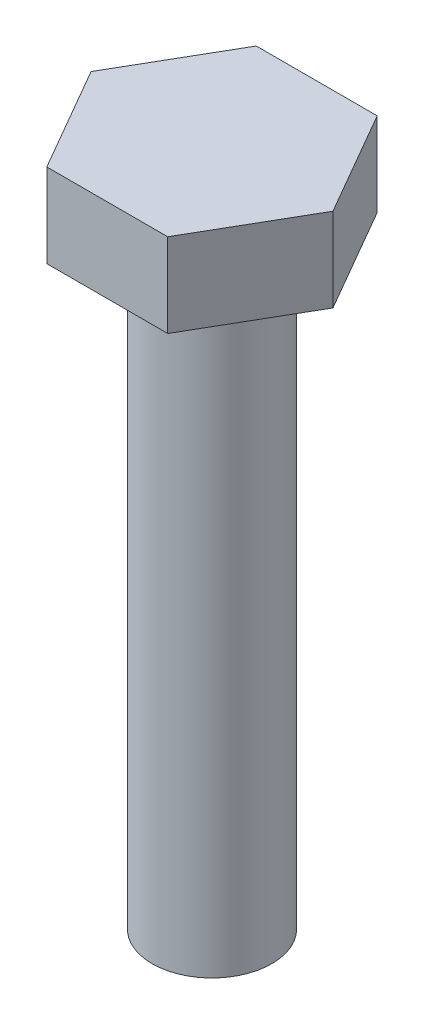
ISO-10303-21;
HEADER;
FILE_DESCRIPTION(('STEP AP214'),'2;1');
FILE_NAME('part.step','',(''),(''),'','','');
FILE_SCHEMA(('AUTOMOTIVE_DESIGN { 1 0 10303 214 1 1 1 1 }'));
ENDSEC;
DATA;
#1=APPLICATION_CONTEXT('core data for automotive mechanical design processes');
#2=APPLICATION_PROTOCOL_DEFINITION('international standard','automotive_design',2000,#1);
#3=PRODUCT_CONTEXT('',#1,'mechanical');
#4=PRODUCT('Part','Part','',(#3));
#5=PRODUCT_RELATED_PRODUCT_CATEGORY('part','',(#4));
#6=PRODUCT_DEFINITION_FORMATION('','',#4);
#7=PRODUCT_DEFINITION_CONTEXT('part definition',#1,'design');
#8=PRODUCT_DEFINITION('design','',#6,#7);
#9=PRODUCT_DEFINITION_SHAPE('','',#8);
#10=(LENGTH_UNIT() NAMED_UNIT(*) SI_UNIT(.MILLI.,.METRE.));
#11=(NAMED_UNIT(*) PLANE_ANGLE_UNIT() SI_UNIT($,.RADIAN.));
#12=(NAMED_UNIT(*) SI_UNIT($,.STERADIAN.) SOLID_ANGLE_UNIT());
#13=UNCERTAINTY_MEASURE_WITH_UNIT(LENGTH_MEASURE(1.E-05),#10,'distance_accuracy_value','');
#14=(GEOMETRIC_REPRESENTATION_CONTEXT(3) GLOBAL_UNCERTAINTY_ASSIGNED_CONTEXT((#13)) GLOBAL_UNIT_ASSIGNED_CONTEXT((#10,
#11,#12)) REPRESENTATION_CONTEXT('',''));
#15=CARTESIAN_POINT('',(0.,0.,0.));
#16=DIRECTION('',(0.,0.,1.));
#17=DIRECTION('',(1.,0.,0.));
#18=AXIS2_PLACEMENT_3D('',#15,#16,#17);
#19=CARTESIAN_POINT('',(0.,20.,0.));
#20=DIRECTION('',(0.,-1.,0.));
#21=DIRECTION('',(0.,0.,-1.));
#22=AXIS2_PLACEMENT_3D('',#19,#20,#21);
#23=CYLINDRICAL_SURFACE('',#22,2.);
#24=CARTESIAN_POINT('',(0.,20.,0.));
#25=DIRECTION('',(0.,1.,0.));
#26=DIRECTION('',(0.,0.,1.));
#27=AXIS2_PLACEMENT_3D('',#24,#25,#26);
#28=CIRCLE('',#27,2.);
#29=CARTESIAN_POINT('',(0.,20.,2.));
#30=VERTEX_POINT('',#29);
#31=EDGE_CURVE('E11',#30,#30,#28,.T.);
#32=ORIENTED_EDGE('',*,*,#31,.F.);
#33=EDGE_LOOP('',(#32));
#34=FACE_BOUND('',#33,.T.);
#35=CARTESIAN_POINT('',(0.,0.,0.));
#36=DIRECTION('',(0.,1.,0.));
#37=DIRECTION('',(0.,0.,1.));
#38=AXIS2_PLACEMENT_3D('',#35,#36,#37);
#39=CIRCLE('',#38,2.);
#40=CARTESIAN_POINT('',(0.,0.,2.));
#41=VERTEX_POINT('',#40);
#42=EDGE_CURVE('E38',#41,#41,#39,.T.);
#43=ORIENTED_EDGE('',*,*,#42,.T.);
#44=EDGE_LOOP('',(#43));
#45=FACE_BOUND('',#44,.T.);
#46=ADVANCED_FACE('F35',(#34,#45),#23,.T.);
#47=CARTESIAN_POINT('',(0.,0.,0.));
#48=DIRECTION('',(0.,1.,0.));
#49=DIRECTION('',(0.,0.,1.));
#50=AXIS2_PLACEMENT_3D('',#47,#48,#49);
#51=PLANE('',#50);
#52=ORIENTED_EDGE('',*,*,#42,.F.);
#53=EDGE_LOOP('',(#52));
#54=FACE_BOUND('',#53,.T.);
#55=ADVANCED_FACE('F143',(#54),#51,.F.);
#56=CARTESIAN_POINT('',(2.02072594216369,22.8,3.5));
#57=DIRECTION('',(-0.866025403784439,0.,-0.5));
#58=DIRECTION('',(-0.5,0.,0.866025403784439));
#59=AXIS2_PLACEMENT_3D('',#56,#57,#58);
#60=PLANE('',#59);
#61=DIRECTION('',(0.5,0.,-0.866025403784439));
#62=VECTOR('',#61,1.);
#63=CARTESIAN_POINT('',(2.02072594216369,20.,3.5));
#64=LINE('',#63,#62);
#65=CARTESIAN_POINT('',(2.02072594216369,20.,3.5));
#66=VERTEX_POINT('',#65);
#67=CARTESIAN_POINT('',(4.04145188432738,20.,0.));
#68=VERTEX_POINT('',#67);
#69=EDGE_CURVE('E120',#66,#68,#64,.T.);
#70=ORIENTED_EDGE('',*,*,#69,.T.);
#71=DIRECTION('',(0.,-1.,0.));
#72=VECTOR('',#71,1.);
#73=CARTESIAN_POINT('',(4.04145188432738,22.8,0.));
#74=LINE('',#73,#72);
#75=CARTESIAN_POINT('',(4.04145188432738,22.8,0.));
#76=VERTEX_POINT('',#75);
#77=EDGE_CURVE('E137',#76,#68,#74,.T.);
#78=ORIENTED_EDGE('',*,*,#77,.F.);
#79=DIRECTION('',(0.5,0.,-0.866025403784439));
#80=VECTOR('',#79,1.);
#81=CARTESIAN_POINT('',(2.02072594216369,22.8,3.5));
#82=LINE('',#81,#80);
#83=CARTESIAN_POINT('',(2.02072594216369,22.8,3.5));
#84=VERTEX_POINT('',#83);
#85=EDGE_CURVE('E130',#84,#76,#82,.T.);
#86=ORIENTED_EDGE('',*,*,#85,.F.);
#87=DIRECTION('',(0.,-1.,0.));
#88=VECTOR('',#87,1.);
#89=CARTESIAN_POINT('',(2.02072594216369,22.8,3.5));
#90=LINE('',#89,#88);
#91=EDGE_CURVE('E116',#84,#66,#90,.T.);
#92=ORIENTED_EDGE('',*,*,#91,.T.);
#93=EDGE_LOOP('',(#70,#78,#86,#92));
#94=FACE_BOUND('',#93,.T.);
#95=ADVANCED_FACE('F145',(#94),#60,.F.);
#96=CARTESIAN_POINT('',(4.04145188432738,22.8,0.));
#97=DIRECTION('',(-0.866025403784438,0.,0.5));
#98=DIRECTION('',(0.5,0.,0.866025403784438));
#99=AXIS2_PLACEMENT_3D('',#96,#97,#98);
#100=PLANE('',#99);
#101=DIRECTION('',(-0.5,0.,-0.866025403784438));
#102=VECTOR('',#101,1.);
#103=CARTESIAN_POINT('',(4.04145188432738,20.,0.));
#104=LINE('',#103,#102);
#105=CARTESIAN_POINT('',(2.02072594216369,20.,-3.5));
#106=VERTEX_POINT('',#105);
#107=EDGE_CURVE('E123',#68,#106,#104,.T.);
#108=ORIENTED_EDGE('',*,*,#107,.T.);
#109=DIRECTION('',(0.,-1.,0.));
#110=VECTOR('',#109,1.);
#111=CARTESIAN_POINT('',(2.02072594216369,22.8,-3.5));
#112=LINE('',#111,#110);
#113=CARTESIAN_POINT('',(2.02072594216369,22.8,-3.5));
#114=VERTEX_POINT('',#113);
#115=EDGE_CURVE('E134',#114,#106,#112,.T.);
#116=ORIENTED_EDGE('',*,*,#115,.F.);
#117=DIRECTION('',(-0.5,0.,-0.866025403784438));
#118=VECTOR('',#117,1.);
#119=CARTESIAN_POINT('',(4.04145188432738,22.8,0.));
#120=LINE('',#119,#118);
#121=EDGE_CURVE('E89',#76,#114,#120,.T.);
#122=ORIENTED_EDGE('',*,*,#121,.F.);
#123=ORIENTED_EDGE('',*,*,#77,.T.);
#124=EDGE_LOOP('',(#108,#116,#122,#123));
#125=FACE_BOUND('',#124,.T.);
#126=ADVANCED_FACE('F150',(#125),#100,.F.);
#127=CARTESIAN_POINT('',(2.02072594216369,22.8,-3.5));
#128=DIRECTION('',(0.,0.,1.));
#129=DIRECTION('',(1.,0.,0.));
#130=AXIS2_PLACEMENT_3D('',#127,#128,#129);
#131=PLANE('',#130);
#132=DIRECTION('',(-1.,0.,0.));
#133=VECTOR('',#132,1.);
#134=CARTESIAN_POINT('',(2.02072594216369,20.,-3.5));
#135=LINE('',#134,#133);
#136=CARTESIAN_POINT('',(-2.02072594216369,20.,-3.5));
#137=VERTEX_POINT('',#136);
#138=EDGE_CURVE('E125',#106,#137,#135,.T.);
#139=ORIENTED_EDGE('',*,*,#138,.T.);
#140=DIRECTION('',(0.,-1.,0.));
#141=VECTOR('',#140,1.);
#142=CARTESIAN_POINT('',(-2.02072594216369,22.8,-3.5));
#143=LINE('',#142,#141);
#144=CARTESIAN_POINT('',(-2.02072594216369,22.8,-3.5));
#145=VERTEX_POINT('',#144);
#146=EDGE_CURVE('E111',#145,#137,#143,.T.);
#147=ORIENTED_EDGE('',*,*,#146,.F.);
#148=DIRECTION('',(-1.,0.,0.));
#149=VECTOR('',#148,1.);
#150=CARTESIAN_POINT('',(2.02072594216369,22.8,-3.5));
#151=LINE('',#150,#149);
#152=EDGE_CURVE('E102',#114,#145,#151,.T.);
#153=ORIENTED_EDGE('',*,*,#152,.F.);
#154=ORIENTED_EDGE('',*,*,#115,.T.);
#155=EDGE_LOOP('',(#139,#147,#153,#154));
#156=FACE_BOUND('',#155,.T.);
#157=ADVANCED_FACE('F157',(#156),#131,.F.);
#158=CARTESIAN_POINT('',(-2.02072594216369,22.8,-3.5));
#159=DIRECTION('',(0.866025403784439,0.,0.5));
#160=DIRECTION('',(0.5,0.,-0.866025403784439));
#161=AXIS2_PLACEMENT_3D('',#158,#159,#160);
#162=PLANE('',#161);
#163=DIRECTION('',(-0.5,0.,0.866025403784439));
#164=VECTOR('',#163,1.);
#165=CARTESIAN_POINT('',(-2.02072594216369,20.,-3.5));
#166=LINE('',#165,#164);
#167=CARTESIAN_POINT('',(-4.04145188432738,20.,0.));
#168=VERTEX_POINT('',#167);
#169=EDGE_CURVE('E110',#137,#168,#166,.T.);
#170=ORIENTED_EDGE('',*,*,#169,.T.);
#171=DIRECTION('',(0.,-1.,0.));
#172=VECTOR('',#171,1.);
#173=CARTESIAN_POINT('',(-4.04145188432738,22.8,0.));
#174=LINE('',#173,#172);
#175=CARTESIAN_POINT('',(-4.04145188432738,22.8,0.));
#176=VERTEX_POINT('',#175);
#177=EDGE_CURVE('E107',#176,#168,#174,.T.);
#178=ORIENTED_EDGE('',*,*,#177,.F.);
#179=DIRECTION('',(-0.5,0.,0.866025403784439));
#180=VECTOR('',#179,1.);
#181=CARTESIAN_POINT('',(-2.02072594216369,22.8,-3.5));
#182=LINE('',#181,#180);
#183=EDGE_CURVE('E96',#145,#176,#182,.T.);
#184=ORIENTED_EDGE('',*,*,#183,.F.);
#185=ORIENTED_EDGE('',*,*,#146,.T.);
#186=EDGE_LOOP('',(#170,#178,#184,#185));
#187=FACE_BOUND('',#186,.T.);
#188=ADVANCED_FACE('F108',(#187),#162,.F.);
#189=CARTESIAN_POINT('',(-4.04145188432738,22.8,0.));
#190=DIRECTION('',(0.866025403784439,0.,-0.5));
#191=DIRECTION('',(-0.5,0.,-0.866025403784439));
#192=AXIS2_PLACEMENT_3D('',#189,#190,#191);
#193=PLANE('',#192);
#194=DIRECTION('',(0.5,0.,0.866025403784439));
#195=VECTOR('',#194,1.);
#196=CARTESIAN_POINT('',(-4.04145188432738,20.,0.));
#197=LINE('',#196,#195);
#198=CARTESIAN_POINT('',(-2.02072594216369,20.,3.5));
#199=VERTEX_POINT('',#198);
#200=EDGE_CURVE('E74',#168,#199,#197,.T.);
#201=ORIENTED_EDGE('',*,*,#200,.T.);
#202=DIRECTION('',(0.,-1.,0.));
#203=VECTOR('',#202,1.);
#204=CARTESIAN_POINT('',(-2.02072594216369,22.8,3.5));
#205=LINE('',#204,#203);
#206=CARTESIAN_POINT('',(-2.02072594216369,22.8,3.5));
#207=VERTEX_POINT('',#206);
#208=EDGE_CURVE('E112',#207,#199,#205,.T.);
#209=ORIENTED_EDGE('',*,*,#208,.F.);
#210=DIRECTION('',(0.5,0.,0.866025403784439));
#211=VECTOR('',#210,1.);
#212=CARTESIAN_POINT('',(-4.04145188432738,22.8,0.));
#213=LINE('',#212,#211);
#214=EDGE_CURVE('E100',#176,#207,#213,.T.);
#215=ORIENTED_EDGE('',*,*,#214,.F.);
#216=ORIENTED_EDGE('',*,*,#177,.T.);
#217=EDGE_LOOP('',(#201,#209,#215,#216));
#218=FACE_BOUND('',#217,.T.);
#219=ADVANCED_FACE('F114',(#218),#193,.F.);
#220=CARTESIAN_POINT('',(-2.02072594216369,22.8,3.5));
#221=DIRECTION('',(0.,0.,-1.));
#222=DIRECTION('',(-1.,0.,0.));
#223=AXIS2_PLACEMENT_3D('',#220,#221,#222);
#224=PLANE('',#223);
#225=DIRECTION('',(1.,0.,0.));
#226=VECTOR('',#225,1.);
#227=CARTESIAN_POINT('',(-2.02072594216369,20.,3.5));
#228=LINE('',#227,#226);
#229=EDGE_CURVE('E80',#199,#66,#228,.T.);
#230=ORIENTED_EDGE('',*,*,#229,.T.);
#231=ORIENTED_EDGE('',*,*,#91,.F.);
#232=DIRECTION('',(1.,0.,0.));
#233=VECTOR('',#232,1.);
#234=CARTESIAN_POINT('',(-2.02072594216369,22.8,3.5));
#235=LINE('',#234,#233);
#236=EDGE_CURVE('E51',#207,#84,#235,.T.);
#237=ORIENTED_EDGE('',*,*,#236,.F.);
#238=ORIENTED_EDGE('',*,*,#208,.T.);
#239=EDGE_LOOP('',(#230,#231,#237,#238));
#240=FACE_BOUND('',#239,.T.);
#241=ADVANCED_FACE('F165',(#240),#224,.F.);
#242=CARTESIAN_POINT('',(0.,22.8,0.));
#243=DIRECTION('',(0.,1.,0.));
#244=DIRECTION('',(0.,0.,1.));
#245=AXIS2_PLACEMENT_3D('',#242,#243,#244);
#246=PLANE('',#245);
#247=ORIENTED_EDGE('',*,*,#85,.T.);
#248=ORIENTED_EDGE('',*,*,#121,.T.);
#249=ORIENTED_EDGE('',*,*,#152,.T.);
#250=ORIENTED_EDGE('',*,*,#183,.T.);
#251=ORIENTED_EDGE('',*,*,#214,.T.);
#252=ORIENTED_EDGE('',*,*,#236,.T.);
#253=EDGE_LOOP('',(#247,#248,#249,#250,#251,#252));
#254=FACE_BOUND('',#253,.T.);
#255=ADVANCED_FACE('F98',(#254),#246,.T.);
#256=CARTESIAN_POINT('',(0.,20.,0.));
#257=DIRECTION('',(0.,1.,0.));
#258=DIRECTION('',(0.,0.,1.));
#259=AXIS2_PLACEMENT_3D('',#256,#257,#258);
#260=PLANE('',#259);
#261=ORIENTED_EDGE('',*,*,#31,.T.);
#262=EDGE_LOOP('',(#261));
#263=FACE_BOUND('',#262,.T.);
#264=ORIENTED_EDGE('',*,*,#69,.F.);
#265=ORIENTED_EDGE('',*,*,#229,.F.);
#266=ORIENTED_EDGE('',*,*,#200,.F.);
#267=ORIENTED_EDGE('',*,*,#169,.F.);
#268=ORIENTED_EDGE('',*,*,#138,.F.);
#269=ORIENTED_EDGE('',*,*,#107,.F.);
#270=EDGE_LOOP('',(#264,#265,#266,#267,#268,#269));
#271=FACE_BOUND('',#270,.T.);
#272=ADVANCED_FACE('F168',(#263,#271),#260,.F.);
#273=CLOSED_SHELL('',(#46,#55,#95,#126,#157,#188,#219,#241,#255,#272));
#274=MANIFOLD_SOLID_BREP('B2',#273);
#275=ADVANCED_BREP_SHAPE_REPRESENTATION('',(#18,#274),#14);
#276=SHAPE_DEFINITION_REPRESENTATION(#9,#275);
ENDSEC;
END-ISO-10303-21;
